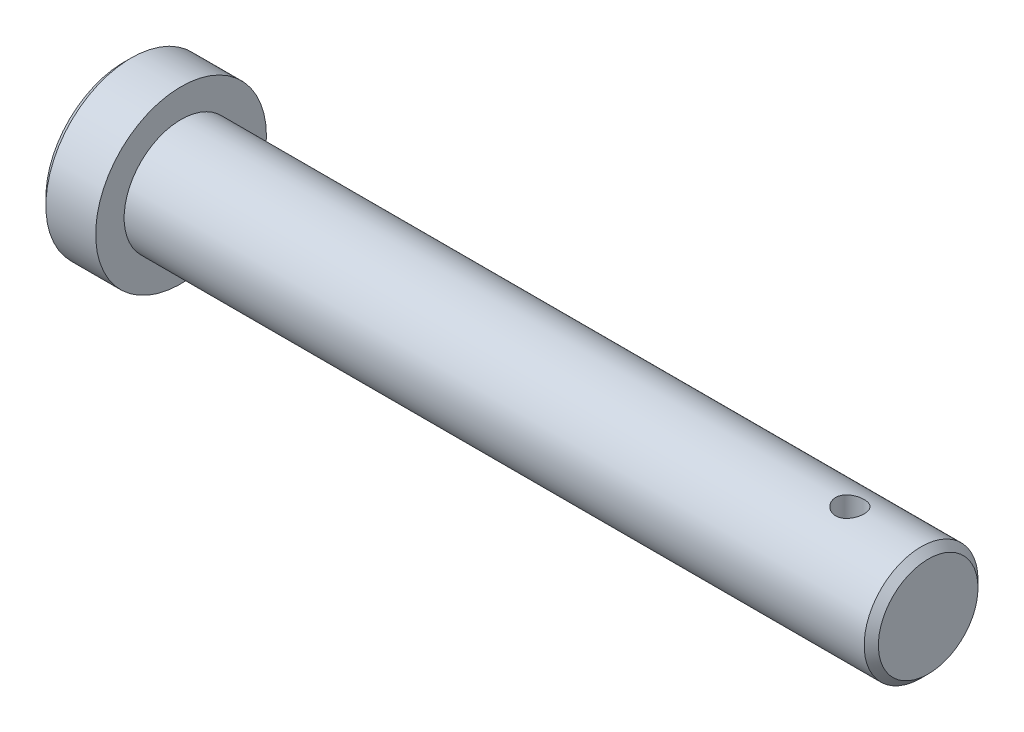
ISO-10303-21;
HEADER;
FILE_DESCRIPTION(('STEP AP214'),'2;1');
FILE_NAME('part.step','',(''),(''),'','','');
FILE_SCHEMA(('AUTOMOTIVE_DESIGN { 1 0 10303 214 1 1 1 1 }'));
ENDSEC;
DATA;
#1=APPLICATION_CONTEXT('core data for automotive mechanical design processes');
#2=APPLICATION_PROTOCOL_DEFINITION('international standard','automotive_design',2000,#1);
#3=PRODUCT_CONTEXT('',#1,'mechanical');
#4=PRODUCT('Part','Part','',(#3));
#5=PRODUCT_RELATED_PRODUCT_CATEGORY('part','',(#4));
#6=PRODUCT_DEFINITION_FORMATION('','',#4);
#7=PRODUCT_DEFINITION_CONTEXT('part definition',#1,'design');
#8=PRODUCT_DEFINITION('design','',#6,#7);
#9=PRODUCT_DEFINITION_SHAPE('','',#8);
#10=(LENGTH_UNIT() NAMED_UNIT(*) SI_UNIT(.MILLI.,.METRE.));
#11=(NAMED_UNIT(*) PLANE_ANGLE_UNIT() SI_UNIT($,.RADIAN.));
#12=(NAMED_UNIT(*) SI_UNIT($,.STERADIAN.) SOLID_ANGLE_UNIT());
#13=UNCERTAINTY_MEASURE_WITH_UNIT(LENGTH_MEASURE(1.E-05),#10,'distance_accuracy_value','');
#14=(GEOMETRIC_REPRESENTATION_CONTEXT(3) GLOBAL_UNCERTAINTY_ASSIGNED_CONTEXT((#13)) GLOBAL_UNIT_ASSIGNED_CONTEXT((#10,
#11,#12)) REPRESENTATION_CONTEXT('',''));
#15=CARTESIAN_POINT('',(0.,0.,0.));
#16=DIRECTION('',(0.,0.,1.));
#17=DIRECTION('',(1.,0.,0.));
#18=AXIS2_PLACEMENT_3D('',#15,#16,#17);
#19=CARTESIAN_POINT('',(8.,0.,0.));
#20=DIRECTION('',(-1.,0.,0.));
#21=DIRECTION('',(0.,0.,1.));
#22=AXIS2_PLACEMENT_3D('',#19,#20,#21);
#23=CYLINDRICAL_SURFACE('',#22,12.);
#24=CARTESIAN_POINT('',(1.,0.,0.));
#25=DIRECTION('',(1.,0.,0.));
#26=DIRECTION('',(0.,0.,-1.));
#27=AXIS2_PLACEMENT_3D('',#24,#25,#26);
#28=CIRCLE('',#27,12.);
#29=CARTESIAN_POINT('',(1.,0.,-12.));
#30=VERTEX_POINT('',#29);
#31=EDGE_CURVE('E114',#30,#30,#28,.T.);
#32=ORIENTED_EDGE('',*,*,#31,.T.);
#33=EDGE_LOOP('',(#32));
#34=FACE_BOUND('',#33,.T.);
#35=CARTESIAN_POINT('',(8.,0.,0.));
#36=DIRECTION('',(1.,0.,0.));
#37=DIRECTION('',(0.,0.,-1.));
#38=AXIS2_PLACEMENT_3D('',#35,#36,#37);
#39=CIRCLE('',#38,12.);
#40=CARTESIAN_POINT('',(8.,0.,-12.));
#41=VERTEX_POINT('',#40);
#42=EDGE_CURVE('E116',#41,#41,#39,.T.);
#43=ORIENTED_EDGE('',*,*,#42,.F.);
#44=EDGE_LOOP('',(#43));
#45=FACE_BOUND('',#44,.T.);
#46=ADVANCED_FACE('F39',(#34,#45),#23,.T.);
#47=CARTESIAN_POINT('',(8.,0.,0.));
#48=DIRECTION('',(1.,0.,0.));
#49=DIRECTION('',(0.,0.,-1.));
#50=AXIS2_PLACEMENT_3D('',#47,#48,#49);
#51=PLANE('',#50);
#52=CARTESIAN_POINT('',(8.,0.,0.));
#53=DIRECTION('',(1.,0.,0.));
#54=DIRECTION('',(0.,0.,-1.));
#55=AXIS2_PLACEMENT_3D('',#52,#53,#54);
#56=CIRCLE('',#55,8.);
#57=CARTESIAN_POINT('',(8.,0.,-8.));
#58=VERTEX_POINT('',#57);
#59=EDGE_CURVE('E60',#58,#58,#56,.T.);
#60=ORIENTED_EDGE('',*,*,#59,.F.);
#61=EDGE_LOOP('',(#60));
#62=FACE_BOUND('',#61,.T.);
#63=ORIENTED_EDGE('',*,*,#42,.T.);
#64=EDGE_LOOP('',(#63));
#65=FACE_BOUND('',#64,.T.);
#66=ADVANCED_FACE('F89',(#62,#65),#51,.T.);
#67=CARTESIAN_POINT('',(0.,0.,0.));
#68=DIRECTION('',(1.,0.,0.));
#69=DIRECTION('',(0.,0.,-1.));
#70=AXIS2_PLACEMENT_3D('',#67,#68,#69);
#71=PLANE('',#70);
#72=CARTESIAN_POINT('',(0.,0.,0.));
#73=DIRECTION('',(1.,0.,0.));
#74=DIRECTION('',(0.,0.,-1.));
#75=AXIS2_PLACEMENT_3D('',#72,#73,#74);
#76=CIRCLE('',#75,11.);
#77=CARTESIAN_POINT('',(0.,0.,-11.));
#78=VERTEX_POINT('',#77);
#79=EDGE_CURVE('E112',#78,#78,#76,.F.);
#80=ORIENTED_EDGE('',*,*,#79,.T.);
#81=EDGE_LOOP('',(#80));
#82=FACE_BOUND('',#81,.T.);
#83=ADVANCED_FACE('F95',(#82),#71,.F.);
#84=CARTESIAN_POINT('',(1.,0.,0.));
#85=DIRECTION('',(1.,0.,0.));
#86=DIRECTION('',(0.,0.,-1.));
#87=AXIS2_PLACEMENT_3D('',#84,#85,#86);
#88=CONICAL_SURFACE('',#87,12.,0.78539816339745);
#89=ORIENTED_EDGE('',*,*,#79,.F.);
#90=EDGE_LOOP('',(#89));
#91=FACE_BOUND('',#90,.T.);
#92=ORIENTED_EDGE('',*,*,#31,.F.);
#93=EDGE_LOOP('',(#92));
#94=FACE_BOUND('',#93,.T.);
#95=ADVANCED_FACE('F86',(#91,#94),#88,.T.);
#96=CARTESIAN_POINT('',(113.,0.,0.));
#97=DIRECTION('',(-1.,0.,0.));
#98=DIRECTION('',(0.,0.,1.));
#99=AXIS2_PLACEMENT_3D('',#96,#97,#98);
#100=CYLINDRICAL_SURFACE('',#99,8.);
#101=CARTESIAN_POINT('',(102.,-7.74596669241483,2.));
#102=CARTESIAN_POINT('',(102.110440600741,-7.74596880070288,1.99999686287445));
#103=CARTESIAN_POINT('',(102.220915918943,-7.74835444811678,1.99082099639812));
#104=CARTESIAN_POINT('',(102.438694062539,-7.75761489594051,1.95441850037103));
#105=CARTESIAN_POINT('',(102.545995003575,-7.76449230897304,1.92718136539368));
#106=CARTESIAN_POINT('',(102.75424283055,-7.7819097967692,1.85559295970563));
#107=CARTESIAN_POINT('',(102.855197724309,-7.79244514152366,1.81126378228359));
#108=CARTESIAN_POINT('',(103.048248682032,-7.81598553623007,1.70681691300911));
#109=CARTESIAN_POINT('',(103.140344369664,-7.82899069102791,1.64669855084855));
#110=CARTESIAN_POINT('',(103.31508931621,-7.856325730845,1.51096674184951));
#111=CARTESIAN_POINT('',(103.39751488028,-7.87067678098427,1.43506951016325));
#112=CARTESIAN_POINT('',(103.548609115488,-7.89890300412235,1.27054565128054));
#113=CARTESIAN_POINT('',(103.617276500497,-7.91277813253111,1.18191783534426));
#114=CARTESIAN_POINT('',(103.739820374105,-7.93872332416466,0.992916160863172));
#115=CARTESIAN_POINT('',(103.793477110529,-7.95076549920474,0.892395660956105));
#116=CARTESIAN_POINT('',(103.883047715322,-7.97144649540787,0.683410547434216));
#117=CARTESIAN_POINT('',(103.918964201532,-7.98008581867475,0.574947108633554));
#118=CARTESIAN_POINT('',(103.971318267663,-7.99283807078544,0.355487007003328));
#119=CARTESIAN_POINT('',(103.988135715461,-7.99703915075451,0.244586175639181));
#120=CARTESIAN_POINT('',(104.00300670342,-8.00074875285838,0.0214630554102187));
#121=CARTESIAN_POINT('',(104.001063017768,-8.00025796877363,-0.0907590356304508));
#122=CARTESIAN_POINT('',(103.9787401198,-7.99470475962828,-0.310704494344769));
#123=CARTESIAN_POINT('',(103.958770939957,-7.98974401872699,-0.418472431202127));
#124=CARTESIAN_POINT('',(103.901622983961,-7.97592669219883,-0.629076494827365));
#125=CARTESIAN_POINT('',(103.864443291698,-7.96706989918753,-0.731912358740868));
#126=CARTESIAN_POINT('',(103.77359794345,-7.94630007760716,-0.930813407003607));
#127=CARTESIAN_POINT('',(103.719786364271,-7.93436015756043,-1.02680901953301));
#128=CARTESIAN_POINT('',(103.597315456707,-7.90871923047719,-1.20855124468097));
#129=CARTESIAN_POINT('',(103.528653545151,-7.89501791721992,-1.29429607017101));
#130=CARTESIAN_POINT('',(103.376233006414,-7.86690971015616,-1.4555480701699));
#131=CARTESIAN_POINT('',(103.292116086122,-7.85249375620734,-1.53071535815039));
#132=CARTESIAN_POINT('',(103.112320021168,-7.82492034813365,-1.66595275192603));
#133=CARTESIAN_POINT('',(103.016640336407,-7.81176295284777,-1.72602215209203));
#134=CARTESIAN_POINT('',(102.815767972681,-7.78816397465319,-1.82957625804519));
#135=CARTESIAN_POINT('',(102.710531415749,-7.77773586980577,-1.87297913394098));
#136=CARTESIAN_POINT('',(102.493931625539,-7.76094912111966,-1.94137124127268));
#137=CARTESIAN_POINT('',(102.382569708813,-7.75458960648175,-1.96636441310582));
#138=CARTESIAN_POINT('',(102.160032398781,-7.74684284831313,-1.99666371093214));
#139=CARTESIAN_POINT('',(102.048929765336,-7.74532871274919,-2.0024723791357));
#140=CARTESIAN_POINT('',(101.827342450737,-7.74709874784831,-1.99561359241243));
#141=CARTESIAN_POINT('',(101.716857713639,-7.75038247681013,-1.98294783827904));
#142=CARTESIAN_POINT('',(101.501508588036,-7.76125665563649,-1.93994037115013));
#143=CARTESIAN_POINT('',(101.396581818743,-7.768775761875,-1.90989125462539));
#144=CARTESIAN_POINT('',(101.193254833719,-7.7872057461677,-1.83329446533649));
#145=CARTESIAN_POINT('',(101.094855392756,-7.79811702598891,-1.78674483817003));
#146=CARTESIAN_POINT('',(100.905246977706,-7.8223690967461,-1.67741653434924));
#147=CARTESIAN_POINT('',(100.814216927966,-7.83575334885314,-1.61433740306849));
#148=CARTESIAN_POINT('',(100.643849309759,-7.86333666457373,-1.4741205858689));
#149=CARTESIAN_POINT('',(100.56451366668,-7.87753586182776,-1.39698058961087));
#150=CARTESIAN_POINT('',(100.417751165943,-7.90557922425285,-1.22852544196944));
#151=CARTESIAN_POINT('',(100.350671949961,-7.91940561649468,-1.13690390506318));
#152=CARTESIAN_POINT('',(100.232851306439,-7.94477773290987,-0.943405365389353));
#153=CARTESIAN_POINT('',(100.182109026713,-7.95632357603169,-0.841528897915187));
#154=CARTESIAN_POINT('',(100.098843172378,-7.9757609259065,-0.631116403462188));
#155=CARTESIAN_POINT('',(100.066188572497,-7.98367864017925,-0.52263476205577));
#156=CARTESIAN_POINT('',(100.019631732313,-7.99508234716634,-0.30149952063762));
#157=CARTESIAN_POINT('',(100.005725873009,-7.99856919514738,-0.188846730082487));
#158=CARTESIAN_POINT('',(99.9972648208489,-8.00068338817612,0.0341670528866389));
#159=CARTESIAN_POINT('',(100.002196581809,-7.99943957759977,0.144507653932035));
#160=CARTESIAN_POINT('',(100.030095654589,-7.99251792914887,0.362734992829494));
#161=CARTESIAN_POINT('',(100.053062430026,-7.98684022314338,0.470621803561851));
#162=CARTESIAN_POINT('',(100.116104439542,-7.97170865707778,0.680342071289541));
#163=CARTESIAN_POINT('',(100.156086906629,-7.96227529004785,0.782204989161716));
#164=CARTESIAN_POINT('',(100.251941158039,-7.94062577827316,0.97783410608324));
#165=CARTESIAN_POINT('',(100.307814945341,-7.92840928277515,1.07159928253126));
#166=CARTESIAN_POINT('',(100.435430467992,-7.90214499360574,1.2508038568466));
#167=CARTESIAN_POINT('',(100.507520285808,-7.88806033883329,1.33598997659666));
#168=CARTESIAN_POINT('',(100.664845703955,-7.8598129811438,1.493230040547));
#169=CARTESIAN_POINT('',(100.750084632222,-7.84565025934605,1.56528065015317));
#170=CARTESIAN_POINT('',(100.933202828379,-7.81854951691005,1.69552405294366));
#171=CARTESIAN_POINT('',(101.03128824673,-7.80563927346578,1.75343323883275));
#172=CARTESIAN_POINT('',(101.23611097975,-7.78287910989656,1.85185379317093));
#173=CARTESIAN_POINT('',(101.342841932188,-7.77302696466428,1.8923778195043));
#174=CARTESIAN_POINT('',(101.54115402367,-7.75903817501475,1.948845057142));
#175=CARTESIAN_POINT('',(101.631786328772,-7.75417326006998,1.96798634119375));
#176=CARTESIAN_POINT('',(101.814937737995,-7.7476367716524,1.99356458514353));
#177=CARTESIAN_POINT('',(101.907456680489,-7.74596492578216,2.0000026287435));
#178=CARTESIAN_POINT('',(102.,-7.74596669241483,2.));
#179=B_SPLINE_CURVE_WITH_KNOTS('',3,(#101,#102,#103,#104,#105,#106,#107,#108,#109,#110,#111,
#112,#113,#114,#115,#116,#117,#118,#119,#120,#121,#122,#123,#124,#125,#126,#127,#128,#129,#130,
#131,#132,#133,#134,#135,#136,#137,#138,#139,#140,#141,#142,#143,#144,#145,#146,#147,#148,#149,
#150,#151,#152,#153,#154,#155,#156,#157,#158,#159,#160,#161,#162,#163,#164,#165,#166,#167,#168,
#169,#170,#171,#172,#173,#174,#175,#176,#177,#178),.UNSPECIFIED.,.T.,.F.,(4,2,2,2,2,2,2,2,2,2,2,
2,2,2,2,2,2,2,2,2,2,2,2,2,2,2,2,2,2,2,2,2,2,2,2,2,2,2,4),(0.,0.330981953388902,
0.662156593142927,0.992904581732803,1.32366661404381,1.66099163354378,1.99834817183891,
2.34041197118335,2.68242527877673,3.01751000796276,3.35254518932815,3.68014610151156,
4.00776445379827,4.33834299403554,4.66897908375129,5.00856373257526,5.3481642495984,
5.6894114560672,6.03058560103637,6.36274859809372,6.69488101747039,7.02157924007365,
7.34831617137133,7.68146276687326,8.01466415108035,8.35620264772254,8.6977233257564,
9.03673658245541,9.37568439127228,9.70546756901963,10.0352409390158,10.3632390124777,
10.6912784459046,11.0271767726565,11.363160252524,11.7054118182895,12.0474137709605,
12.3247826174462,12.6021278008237),.UNSPECIFIED.);
#180=CARTESIAN_POINT('',(102.,-7.74596669241483,2.));
#181=VERTEX_POINT('',#180);
#182=EDGE_CURVE('E44',#181,#181,#179,.T.);
#183=ORIENTED_EDGE('',*,*,#182,.T.);
#184=EDGE_LOOP('',(#183));
#185=FACE_BOUND('',#184,.T.);
#186=CARTESIAN_POINT('',(102.,7.74596669241483,2.));
#187=CARTESIAN_POINT('',(101.889559399259,7.74596880070288,1.99999686287445));
#188=CARTESIAN_POINT('',(101.779084081057,7.74835444811678,1.99082099639812));
#189=CARTESIAN_POINT('',(101.561305937461,7.75761489594051,1.95441850037103));
#190=CARTESIAN_POINT('',(101.454004996425,7.76449230897304,1.92718136539368));
#191=CARTESIAN_POINT('',(101.24575716945,7.7819097967692,1.85559295970563));
#192=CARTESIAN_POINT('',(101.144802275691,7.79244514152366,1.81126378228359));
#193=CARTESIAN_POINT('',(100.951751317968,7.81598553623007,1.70681691300911));
#194=CARTESIAN_POINT('',(100.859655630336,7.82899069102791,1.64669855084855));
#195=CARTESIAN_POINT('',(100.68491068379,7.856325730845,1.51096674184951));
#196=CARTESIAN_POINT('',(100.60248511972,7.87067678098427,1.43506951016325));
#197=CARTESIAN_POINT('',(100.451390884512,7.89890300412235,1.27054565128054));
#198=CARTESIAN_POINT('',(100.382723499503,7.91277813253111,1.18191783534426));
#199=CARTESIAN_POINT('',(100.260179625895,7.93872332416466,0.992916160863172));
#200=CARTESIAN_POINT('',(100.206522889471,7.95076549920474,0.892395660956105));
#201=CARTESIAN_POINT('',(100.116952284678,7.97144649540787,0.683410547434216));
#202=CARTESIAN_POINT('',(100.081035798468,7.98008581867475,0.574947108633554));
#203=CARTESIAN_POINT('',(100.028681732337,7.99283807078544,0.355487007003328));
#204=CARTESIAN_POINT('',(100.011864284539,7.99703915075451,0.244586175639181));
#205=CARTESIAN_POINT('',(99.9969932965796,8.00074875285838,0.0214630554102186));
#206=CARTESIAN_POINT('',(99.9989369822323,8.00025796877363,-0.0907590356304509));
#207=CARTESIAN_POINT('',(100.0212598802,7.99470475962828,-0.310704494344769));
#208=CARTESIAN_POINT('',(100.041229060043,7.98974401872699,-0.418472431202127));
#209=CARTESIAN_POINT('',(100.098377016039,7.97592669219883,-0.629076494827365));
#210=CARTESIAN_POINT('',(100.135556708302,7.96706989918753,-0.73191235874087));
#211=CARTESIAN_POINT('',(100.22640205655,7.94630007760716,-0.930813407003609));
#212=CARTESIAN_POINT('',(100.280213635729,7.93436015756043,-1.026809019533));
#213=CARTESIAN_POINT('',(100.402684543293,7.90871923047719,-1.20855124468097));
#214=CARTESIAN_POINT('',(100.471346454849,7.89501791721992,-1.29429607017101));
#215=CARTESIAN_POINT('',(100.623766993586,7.86690971015616,-1.45554807016991));
#216=CARTESIAN_POINT('',(100.707883913878,7.85249375620734,-1.53071535815039));
#217=CARTESIAN_POINT('',(100.887679978832,7.82492034813365,-1.66595275192603));
#218=CARTESIAN_POINT('',(100.983359663593,7.81176295284777,-1.72602215209203));
#219=CARTESIAN_POINT('',(101.184232027319,7.78816397465319,-1.82957625804519));
#220=CARTESIAN_POINT('',(101.289468584251,7.77773586980577,-1.87297913394098));
#221=CARTESIAN_POINT('',(101.506068374461,7.76094912111966,-1.94137124127268));
#222=CARTESIAN_POINT('',(101.617430291186,7.75458960648175,-1.96636441310582));
#223=CARTESIAN_POINT('',(101.839967601218,7.74684284831313,-1.99666371093214));
#224=CARTESIAN_POINT('',(101.951070234664,7.74532871274919,-2.0024723791357));
#225=CARTESIAN_POINT('',(102.172657549263,7.74709874784831,-1.99561359241243));
#226=CARTESIAN_POINT('',(102.283142286361,7.75038247681013,-1.98294783827904));
#227=CARTESIAN_POINT('',(102.498491411964,7.76125665563648,-1.93994037115013));
#228=CARTESIAN_POINT('',(102.603418181257,7.768775761875,-1.9098912546254));
#229=CARTESIAN_POINT('',(102.806745166281,7.7872057461677,-1.8332944653365));
#230=CARTESIAN_POINT('',(102.905144607244,7.79811702598891,-1.78674483817003));
#231=CARTESIAN_POINT('',(103.094753022294,7.8223690967461,-1.67741653434924));
#232=CARTESIAN_POINT('',(103.185783072034,7.83575334885313,-1.6143374030685));
#233=CARTESIAN_POINT('',(103.356150690241,7.86333666457373,-1.4741205858689));
#234=CARTESIAN_POINT('',(103.43548633332,7.87753586182776,-1.39698058961087));
#235=CARTESIAN_POINT('',(103.582248834057,7.90557922425285,-1.22852544196944));
#236=CARTESIAN_POINT('',(103.649328050039,7.91940561649468,-1.13690390506318));
#237=CARTESIAN_POINT('',(103.767148693561,7.94477773290987,-0.943405365389353));
#238=CARTESIAN_POINT('',(103.817890973287,7.95632357603169,-0.841528897915187));
#239=CARTESIAN_POINT('',(103.901156827622,7.9757609259065,-0.631116403462188));
#240=CARTESIAN_POINT('',(103.933811427503,7.98367864017925,-0.52263476205577));
#241=CARTESIAN_POINT('',(103.980368267687,7.99508234716634,-0.301499520637619));
#242=CARTESIAN_POINT('',(103.994274126991,7.99856919514738,-0.188846730082487));
#243=CARTESIAN_POINT('',(104.002735179151,8.00068338817612,0.0341670528866382));
#244=CARTESIAN_POINT('',(103.997803418191,7.99943957759977,0.144507653932034));
#245=CARTESIAN_POINT('',(103.969904345411,7.99251792914887,0.362734992829493));
#246=CARTESIAN_POINT('',(103.946937569974,7.98684022314338,0.470621803561851));
#247=CARTESIAN_POINT('',(103.883895560458,7.97170865707778,0.680342071289541));
#248=CARTESIAN_POINT('',(103.843913093371,7.96227529004785,0.782204989161717));
#249=CARTESIAN_POINT('',(103.748058841961,7.94062577827316,0.97783410608324));
#250=CARTESIAN_POINT('',(103.692185054659,7.92840928277515,1.07159928253126));
#251=CARTESIAN_POINT('',(103.564569532008,7.90214499360574,1.2508038568466));
#252=CARTESIAN_POINT('',(103.492479714192,7.88806033883329,1.33598997659666));
#253=CARTESIAN_POINT('',(103.335154296045,7.8598129811438,1.493230040547));
#254=CARTESIAN_POINT('',(103.249915367778,7.84565025934605,1.56528065015317));
#255=CARTESIAN_POINT('',(103.066797171621,7.81854951691005,1.69552405294366));
#256=CARTESIAN_POINT('',(102.968711753269,7.80563927346578,1.75343323883275));
#257=CARTESIAN_POINT('',(102.76388902025,7.78287910989656,1.85185379317093));
#258=CARTESIAN_POINT('',(102.657158067812,7.77302696466428,1.8923778195043));
#259=CARTESIAN_POINT('',(102.45884597633,7.75903817501475,1.948845057142));
#260=CARTESIAN_POINT('',(102.368213671228,7.75417326006998,1.96798634119375));
#261=CARTESIAN_POINT('',(102.185062262005,7.7476367716524,1.99356458514353));
#262=CARTESIAN_POINT('',(102.092543319511,7.74596492578216,2.0000026287435));
#263=CARTESIAN_POINT('',(102.,7.74596669241483,2.));
#264=B_SPLINE_CURVE_WITH_KNOTS('',3,(#186,#187,#188,#189,#190,#191,#192,#193,#194,#195,#196,
#197,#198,#199,#200,#201,#202,#203,#204,#205,#206,#207,#208,#209,#210,#211,#212,#213,#214,#215,
#216,#217,#218,#219,#220,#221,#222,#223,#224,#225,#226,#227,#228,#229,#230,#231,#232,#233,#234,
#235,#236,#237,#238,#239,#240,#241,#242,#243,#244,#245,#246,#247,#248,#249,#250,#251,#252,#253,
#254,#255,#256,#257,#258,#259,#260,#261,#262,#263),.UNSPECIFIED.,.T.,.F.,(4,2,2,2,2,2,2,2,2,2,2,
2,2,2,2,2,2,2,2,2,2,2,2,2,2,2,2,2,2,2,2,2,2,2,2,2,2,2,4),(0.,0.330981953388917,
0.662156593142927,0.992904581732803,1.32366661404381,1.66099163354378,1.99834817183891,
2.34041197118335,2.68242527877673,3.01751000796276,3.35254518932815,3.68014610151156,
4.00776445379828,4.33834299403555,4.66897908375129,5.00856373257526,5.3481642495984,
5.6894114560672,6.03058560103637,6.36274859809372,6.69488101747039,7.02157924007364,
7.34831617137133,7.68146276687325,8.01466415108035,8.35620264772253,8.6977233257564,
9.03673658245541,9.37568439127228,9.70546756901962,10.0352409390158,10.3632390124777,
10.6912784459046,11.0271767726565,11.363160252524,11.7054118182895,12.0474137709605,
12.3247826174462,12.6021278008237),.UNSPECIFIED.);
#265=CARTESIAN_POINT('',(102.,7.74596669241483,2.));
#266=VERTEX_POINT('',#265);
#267=EDGE_CURVE('E63',#266,#266,#264,.T.);
#268=ORIENTED_EDGE('',*,*,#267,.T.);
#269=EDGE_LOOP('',(#268));
#270=FACE_BOUND('',#269,.T.);
#271=CARTESIAN_POINT('',(112.,0.,0.));
#272=DIRECTION('',(1.,0.,0.));
#273=DIRECTION('',(0.,0.,-1.));
#274=AXIS2_PLACEMENT_3D('',#271,#272,#273);
#275=CIRCLE('',#274,8.);
#276=CARTESIAN_POINT('',(112.,0.,-8.));
#277=VERTEX_POINT('',#276);
#278=EDGE_CURVE('E10',#277,#277,#275,.F.);
#279=ORIENTED_EDGE('',*,*,#278,.T.);
#280=EDGE_LOOP('',(#279));
#281=FACE_BOUND('',#280,.T.);
#282=ORIENTED_EDGE('',*,*,#59,.T.);
#283=EDGE_LOOP('',(#282));
#284=FACE_BOUND('',#283,.T.);
#285=ADVANCED_FACE('F69',(#185,#270,#281,#284),#100,.T.);
#286=CARTESIAN_POINT('',(113.,0.,0.));
#287=DIRECTION('',(1.,0.,0.));
#288=DIRECTION('',(0.,0.,-1.));
#289=AXIS2_PLACEMENT_3D('',#286,#287,#288);
#290=PLANE('',#289);
#291=CARTESIAN_POINT('',(113.,0.,0.));
#292=DIRECTION('',(1.,0.,0.));
#293=DIRECTION('',(0.,0.,-1.));
#294=AXIS2_PLACEMENT_3D('',#291,#292,#293);
#295=CIRCLE('',#294,7.00000000000001);
#296=CARTESIAN_POINT('',(113.,0.,-7.00000000000001));
#297=VERTEX_POINT('',#296);
#298=EDGE_CURVE('E54',#297,#297,#295,.T.);
#299=ORIENTED_EDGE('',*,*,#298,.T.);
#300=EDGE_LOOP('',(#299));
#301=FACE_BOUND('',#300,.T.);
#302=ADVANCED_FACE('F77',(#301),#290,.T.);
#303=CARTESIAN_POINT('',(113.,0.,0.));
#304=DIRECTION('',(-1.,0.,0.));
#305=DIRECTION('',(0.,0.,1.));
#306=AXIS2_PLACEMENT_3D('',#303,#304,#305);
#307=CONICAL_SURFACE('',#306,7.00000000000001,0.785398163397445);
#308=ORIENTED_EDGE('',*,*,#278,.F.);
#309=EDGE_LOOP('',(#308));
#310=FACE_BOUND('',#309,.T.);
#311=ORIENTED_EDGE('',*,*,#298,.F.);
#312=EDGE_LOOP('',(#311));
#313=FACE_BOUND('',#312,.T.);
#314=ADVANCED_FACE('F42',(#310,#313),#307,.T.);
#315=CARTESIAN_POINT('',(102.,-12.,0.));
#316=DIRECTION('',(0.,1.,0.));
#317=DIRECTION('',(0.,0.,1.));
#318=AXIS2_PLACEMENT_3D('',#315,#316,#317);
#319=CYLINDRICAL_SURFACE('',#318,2.);
#320=ORIENTED_EDGE('',*,*,#267,.F.);
#321=EDGE_LOOP('',(#320));
#322=FACE_BOUND('',#321,.T.);
#323=ORIENTED_EDGE('',*,*,#182,.F.);
#324=EDGE_LOOP('',(#323));
#325=FACE_BOUND('',#324,.T.);
#326=ADVANCED_FACE('F73',(#322,#325),#319,.F.);
#327=CLOSED_SHELL('',(#46,#66,#83,#95,#285,#302,#314,#326));
#328=MANIFOLD_SOLID_BREP('B2',#327);
#329=ADVANCED_BREP_SHAPE_REPRESENTATION('',(#18,#328),#14);
#330=SHAPE_DEFINITION_REPRESENTATION(#9,#329);
ENDSEC;
END-ISO-10303-21;
